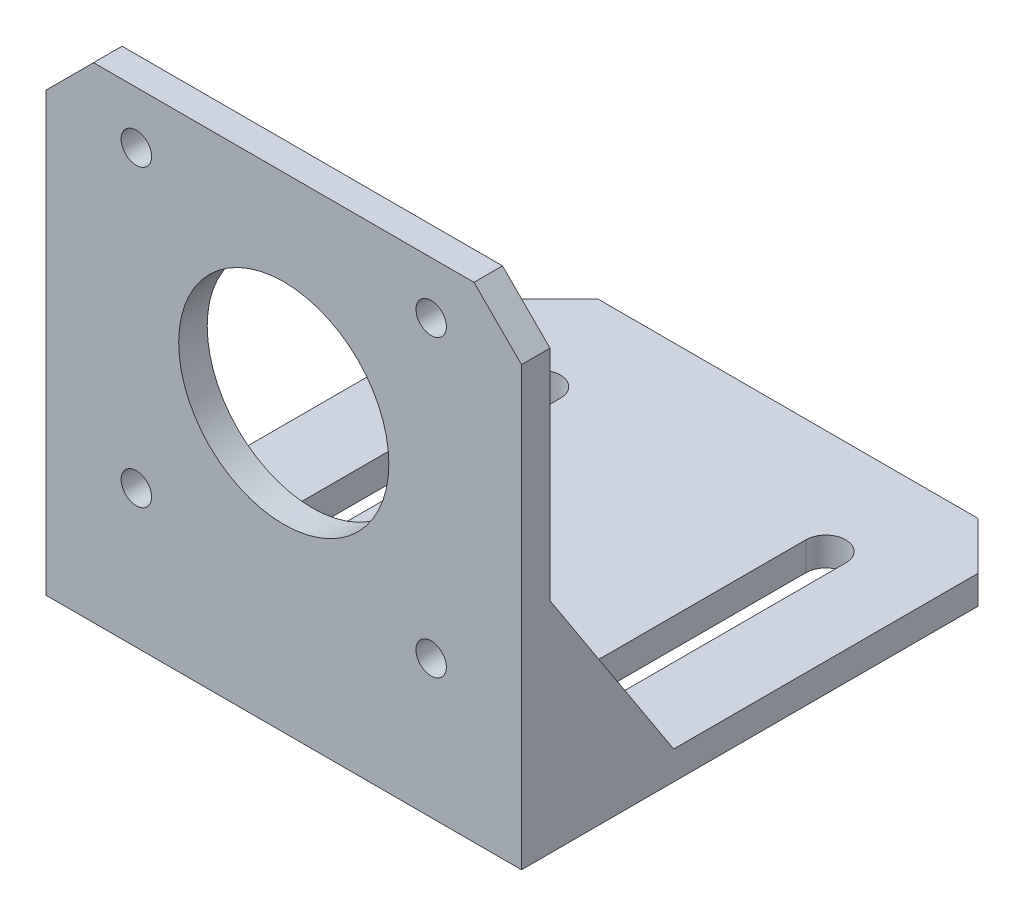
ISO-10303-21;
HEADER;
FILE_DESCRIPTION(('STEP AP214'),'2;1');
FILE_NAME('part.step','',(''),(''),'','','');
FILE_SCHEMA(('AUTOMOTIVE_DESIGN { 1 0 10303 214 1 1 1 1 }'));
ENDSEC;
DATA;
#1=APPLICATION_CONTEXT('core data for automotive mechanical design processes');
#2=APPLICATION_PROTOCOL_DEFINITION('international standard','automotive_design',2000,#1);
#3=PRODUCT_CONTEXT('',#1,'mechanical');
#4=PRODUCT('Part','Part','',(#3));
#5=PRODUCT_RELATED_PRODUCT_CATEGORY('part','',(#4));
#6=PRODUCT_DEFINITION_FORMATION('','',#4);
#7=PRODUCT_DEFINITION_CONTEXT('part definition',#1,'design');
#8=PRODUCT_DEFINITION('design','',#6,#7);
#9=PRODUCT_DEFINITION_SHAPE('','',#8);
#10=(LENGTH_UNIT() NAMED_UNIT(*) SI_UNIT(.MILLI.,.METRE.));
#11=(NAMED_UNIT(*) PLANE_ANGLE_UNIT() SI_UNIT($,.RADIAN.));
#12=(NAMED_UNIT(*) SI_UNIT($,.STERADIAN.) SOLID_ANGLE_UNIT());
#13=UNCERTAINTY_MEASURE_WITH_UNIT(LENGTH_MEASURE(1.E-05),#10,'distance_accuracy_value','');
#14=(GEOMETRIC_REPRESENTATION_CONTEXT(3) GLOBAL_UNCERTAINTY_ASSIGNED_CONTEXT((#13)) GLOBAL_UNIT_ASSIGNED_CONTEXT((#10,
#11,#12)) REPRESENTATION_CONTEXT('',''));
#15=CARTESIAN_POINT('',(0.,0.,0.));
#16=DIRECTION('',(0.,0.,1.));
#17=DIRECTION('',(1.,0.,0.));
#18=AXIS2_PLACEMENT_3D('',#15,#16,#17);
#19=CARTESIAN_POINT('',(50.,-6.94551845342701,10.6854130052724));
#20=DIRECTION('',(0.,0.544988350595413,-0.838443616300638));
#21=DIRECTION('',(0.,0.838443616300638,0.544988350595413));
#22=AXIS2_PLACEMENT_3D('',#19,#20,#21);
#23=PLANE('',#22);
#24=DIRECTION('',(-1.,0.,0.));
#25=VECTOR('',#24,1.);
#26=CARTESIAN_POINT('',(50.,-27.9999999999999,-3.));
#27=LINE('',#26,#25);
#28=CARTESIAN_POINT('',(3.,-28.,-3.00000000000001));
#29=VERTEX_POINT('',#28);
#30=CARTESIAN_POINT('',(0.,-27.9999999999999,-3.));
#31=VERTEX_POINT('',#30);
#32=EDGE_CURVE('E219',#29,#31,#27,.T.);
#33=ORIENTED_EDGE('',*,*,#32,.F.);
#34=DIRECTION('',(0.,-0.838443616300638,-0.544988350595413));
#35=VECTOR('',#34,1.);
#36=CARTESIAN_POINT('',(3.,-6.94551845342701,10.6854130052724));
#37=LINE('',#36,#35);
#38=CARTESIAN_POINT('',(3.,-48.,-16.));
#39=VERTEX_POINT('',#38);
#40=EDGE_CURVE('E11',#29,#39,#37,.T.);
#41=ORIENTED_EDGE('',*,*,#40,.T.);
#42=DIRECTION('',(-1.,0.,0.));
#43=VECTOR('',#42,1.);
#44=CARTESIAN_POINT('',(50.,-48.,-16.));
#45=LINE('',#44,#43);
#46=CARTESIAN_POINT('',(0.,-48.,-16.));
#47=VERTEX_POINT('',#46);
#48=EDGE_CURVE('E268',#39,#47,#45,.T.);
#49=ORIENTED_EDGE('',*,*,#48,.T.);
#50=DIRECTION('',(0.,-0.838443616300638,-0.544988350595413));
#51=VECTOR('',#50,1.);
#52=CARTESIAN_POINT('',(0.,-6.94551845342701,10.6854130052724));
#53=LINE('',#52,#51);
#54=EDGE_CURVE('E269',#31,#47,#53,.T.);
#55=ORIENTED_EDGE('',*,*,#54,.F.);
#56=EDGE_LOOP('',(#33,#41,#49,#55));
#57=FACE_BOUND('',#56,.T.);
#58=ADVANCED_FACE('F45',(#57),#23,.T.);
#59=CARTESIAN_POINT('',(50.,-48.,-16.));
#60=VERTEX_POINT('',#59);
#61=CARTESIAN_POINT('',(47.,-48.,-16.));
#62=VERTEX_POINT('',#61);
#63=EDGE_CURVE('E241',#60,#62,#45,.T.);
#64=ORIENTED_EDGE('',*,*,#63,.T.);
#65=DIRECTION('',(0.,0.838443616300638,0.544988350595413));
#66=VECTOR('',#65,1.);
#67=CARTESIAN_POINT('',(47.,-6.94551845342701,10.6854130052724));
#68=LINE('',#67,#66);
#69=CARTESIAN_POINT('',(47.,-28.,-3.00000000000001));
#70=VERTEX_POINT('',#69);
#71=EDGE_CURVE('E53',#62,#70,#68,.T.);
#72=ORIENTED_EDGE('',*,*,#71,.T.);
#73=CARTESIAN_POINT('',(50.,-27.9999999999999,-3.));
#74=VERTEX_POINT('',#73);
#75=EDGE_CURVE('E224',#74,#70,#27,.T.);
#76=ORIENTED_EDGE('',*,*,#75,.F.);
#77=DIRECTION('',(0.,-0.838443616300638,-0.544988350595413));
#78=VECTOR('',#77,1.);
#79=CARTESIAN_POINT('',(50.,-6.94551845342701,10.6854130052724));
#80=LINE('',#79,#78);
#81=EDGE_CURVE('E252',#74,#60,#80,.T.);
#82=ORIENTED_EDGE('',*,*,#81,.T.);
#83=EDGE_LOOP('',(#64,#72,#76,#82));
#84=FACE_BOUND('',#83,.T.);
#85=ADVANCED_FACE('F237',(#84),#23,.T.);
#86=CARTESIAN_POINT('',(50.,0.,-3.));
#87=DIRECTION('',(0.,0.,-1.));
#88=DIRECTION('',(0.,1.,0.));
#89=AXIS2_PLACEMENT_3D('',#86,#87,#88);
#90=PLANE('',#89);
#91=CARTESIAN_POINT('',(40.5,-5.50000000000001,-3.));
#92=DIRECTION('',(0.,0.,-1.));
#93=DIRECTION('',(0.,1.,0.));
#94=AXIS2_PLACEMENT_3D('',#91,#92,#93);
#95=CIRCLE('',#94,1.6);
#96=CARTESIAN_POINT('',(40.5,-3.90000000000001,-3.));
#97=VERTEX_POINT('',#96);
#98=EDGE_CURVE('E457',#97,#97,#95,.T.);
#99=ORIENTED_EDGE('',*,*,#98,.F.);
#100=EDGE_LOOP('',(#99));
#101=FACE_BOUND('',#100,.T.);
#102=DIRECTION('',(-0.707106781186547,0.707106781186548,0.));
#103=VECTOR('',#102,1.);
#104=CARTESIAN_POINT('',(50.,-5.,-3.));
#105=LINE('',#104,#103);
#106=CARTESIAN_POINT('',(50.,-5.,-3.));
#107=VERTEX_POINT('',#106);
#108=CARTESIAN_POINT('',(45.,0.,-3.));
#109=VERTEX_POINT('',#108);
#110=EDGE_CURVE('E248',#107,#109,#105,.T.);
#111=ORIENTED_EDGE('',*,*,#110,.F.);
#112=DIRECTION('',(0.,-1.,0.));
#113=VECTOR('',#112,1.);
#114=CARTESIAN_POINT('',(50.,0.,-3.));
#115=LINE('',#114,#113);
#116=EDGE_CURVE('E247',#107,#74,#115,.T.);
#117=ORIENTED_EDGE('',*,*,#116,.T.);
#118=ORIENTED_EDGE('',*,*,#75,.T.);
#119=DIRECTION('',(0.,-1.,0.));
#120=VECTOR('',#119,1.);
#121=CARTESIAN_POINT('',(47.,-28.,-3.00000000000001));
#122=LINE('',#121,#120);
#123=CARTESIAN_POINT('',(47.,-48.,-3.00000000000001));
#124=VERTEX_POINT('',#123);
#125=EDGE_CURVE('E245',#70,#124,#122,.T.);
#126=ORIENTED_EDGE('',*,*,#125,.T.);
#127=DIRECTION('',(1.,0.,0.));
#128=VECTOR('',#127,1.);
#129=CARTESIAN_POINT('',(3.,-48.,-3.00000000000001));
#130=LINE('',#129,#128);
#131=CARTESIAN_POINT('',(3.,-48.,-3.00000000000001));
#132=VERTEX_POINT('',#131);
#133=EDGE_CURVE('E431',#132,#124,#130,.T.);
#134=ORIENTED_EDGE('',*,*,#133,.F.);
#135=DIRECTION('',(0.,-1.,0.));
#136=VECTOR('',#135,1.);
#137=CARTESIAN_POINT('',(3.,-28.,-3.00000000000001));
#138=LINE('',#137,#136);
#139=EDGE_CURVE('E273',#29,#132,#138,.T.);
#140=ORIENTED_EDGE('',*,*,#139,.F.);
#141=ORIENTED_EDGE('',*,*,#32,.T.);
#142=DIRECTION('',(0.,-1.,0.));
#143=VECTOR('',#142,1.);
#144=CARTESIAN_POINT('',(0.,0.,-3.));
#145=LINE('',#144,#143);
#146=CARTESIAN_POINT('',(0.,-5.,-3.));
#147=VERTEX_POINT('',#146);
#148=EDGE_CURVE('E211',#147,#31,#145,.T.);
#149=ORIENTED_EDGE('',*,*,#148,.F.);
#150=DIRECTION('',(-0.707106781186548,-0.707106781186547,0.));
#151=VECTOR('',#150,1.);
#152=CARTESIAN_POINT('',(0.,-5.,-3.));
#153=LINE('',#152,#151);
#154=CARTESIAN_POINT('',(5.,0.,-3.));
#155=VERTEX_POINT('',#154);
#156=EDGE_CURVE('E68',#155,#147,#153,.T.);
#157=ORIENTED_EDGE('',*,*,#156,.F.);
#158=DIRECTION('',(-1.,0.,0.));
#159=VECTOR('',#158,1.);
#160=CARTESIAN_POINT('',(50.,0.,-3.));
#161=LINE('',#160,#159);
#162=EDGE_CURVE('E209',#109,#155,#161,.T.);
#163=ORIENTED_EDGE('',*,*,#162,.F.);
#164=EDGE_LOOP('',(#111,#117,#118,#126,#134,#140,#141,#149,#157,#163));
#165=FACE_BOUND('',#164,.T.);
#166=CARTESIAN_POINT('',(9.50000000000001,-5.50000000000001,-3.));
#167=DIRECTION('',(0.,0.,-1.));
#168=DIRECTION('',(0.,1.,0.));
#169=AXIS2_PLACEMENT_3D('',#166,#167,#168);
#170=CIRCLE('',#169,1.6);
#171=CARTESIAN_POINT('',(9.50000000000001,-3.90000000000001,-3.));
#172=VERTEX_POINT('',#171);
#173=EDGE_CURVE('E471',#172,#172,#170,.T.);
#174=ORIENTED_EDGE('',*,*,#173,.F.);
#175=EDGE_LOOP('',(#174));
#176=FACE_BOUND('',#175,.T.);
#177=CARTESIAN_POINT('',(9.49999999999969,-36.5,-3.));
#178=DIRECTION('',(0.,0.,-1.));
#179=DIRECTION('',(0.,1.,0.));
#180=AXIS2_PLACEMENT_3D('',#177,#178,#179);
#181=CIRCLE('',#180,1.6);
#182=CARTESIAN_POINT('',(9.49999999999969,-34.9,-3.));
#183=VERTEX_POINT('',#182);
#184=EDGE_CURVE('E483',#183,#183,#181,.T.);
#185=ORIENTED_EDGE('',*,*,#184,.F.);
#186=EDGE_LOOP('',(#185));
#187=FACE_BOUND('',#186,.T.);
#188=CARTESIAN_POINT('',(40.4999999999997,-36.5,-3.));
#189=DIRECTION('',(0.,0.,-1.));
#190=DIRECTION('',(0.,1.,0.));
#191=AXIS2_PLACEMENT_3D('',#188,#189,#190);
#192=CIRCLE('',#191,1.6);
#193=CARTESIAN_POINT('',(40.4999999999997,-34.9,-3.));
#194=VERTEX_POINT('',#193);
#195=EDGE_CURVE('E491',#194,#194,#192,.T.);
#196=ORIENTED_EDGE('',*,*,#195,.F.);
#197=EDGE_LOOP('',(#196));
#198=FACE_BOUND('',#197,.T.);
#199=CARTESIAN_POINT('',(25.,-21.,-3.));
#200=DIRECTION('',(0.,0.,-1.));
#201=DIRECTION('',(0.,1.,0.));
#202=AXIS2_PLACEMENT_3D('',#199,#200,#201);
#203=CIRCLE('',#202,11.05);
#204=CARTESIAN_POINT('',(25.,-9.95,-3.));
#205=VERTEX_POINT('',#204);
#206=EDGE_CURVE('E461',#205,#205,#203,.T.);
#207=ORIENTED_EDGE('',*,*,#206,.F.);
#208=EDGE_LOOP('',(#207));
#209=FACE_BOUND('',#208,.T.);
#210=ADVANCED_FACE('F207',(#101,#165,#176,#187,#198,#209),#90,.T.);
#211=CARTESIAN_POINT('',(50.,0.,0.));
#212=DIRECTION('',(0.,1.,0.));
#213=DIRECTION('',(0.,0.,1.));
#214=AXIS2_PLACEMENT_3D('',#211,#212,#213);
#215=PLANE('',#214);
#216=DIRECTION('',(0.,0.,-1.));
#217=VECTOR('',#216,1.);
#218=CARTESIAN_POINT('',(45.,0.,0.));
#219=LINE('',#218,#217);
#220=CARTESIAN_POINT('',(45.,0.,0.));
#221=VERTEX_POINT('',#220);
#222=EDGE_CURVE('E217',#221,#109,#219,.T.);
#223=ORIENTED_EDGE('',*,*,#222,.T.);
#224=ORIENTED_EDGE('',*,*,#162,.T.);
#225=DIRECTION('',(0.,0.,-1.));
#226=VECTOR('',#225,1.);
#227=CARTESIAN_POINT('',(5.,0.,0.));
#228=LINE('',#227,#226);
#229=CARTESIAN_POINT('',(5.,0.,0.));
#230=VERTEX_POINT('',#229);
#231=EDGE_CURVE('E192',#230,#155,#228,.T.);
#232=ORIENTED_EDGE('',*,*,#231,.F.);
#233=DIRECTION('',(-1.,0.,0.));
#234=VECTOR('',#233,1.);
#235=CARTESIAN_POINT('',(50.,0.,0.));
#236=LINE('',#235,#234);
#237=EDGE_CURVE('E220',#221,#230,#236,.T.);
#238=ORIENTED_EDGE('',*,*,#237,.F.);
#239=EDGE_LOOP('',(#223,#224,#232,#238));
#240=FACE_BOUND('',#239,.T.);
#241=ADVANCED_FACE('F216',(#240),#215,.T.);
#242=CARTESIAN_POINT('',(50.,0.,0.));
#243=DIRECTION('',(0.,0.,-1.));
#244=DIRECTION('',(-1.,0.,0.));
#245=AXIS2_PLACEMENT_3D('',#242,#243,#244);
#246=PLANE('',#245);
#247=CARTESIAN_POINT('',(40.5,-5.50000000000001,0.));
#248=DIRECTION('',(0.,0.,-1.));
#249=DIRECTION('',(0.,1.,0.));
#250=AXIS2_PLACEMENT_3D('',#247,#248,#249);
#251=CIRCLE('',#250,1.6);
#252=CARTESIAN_POINT('',(40.5,-3.90000000000001,0.));
#253=VERTEX_POINT('',#252);
#254=EDGE_CURVE('E462',#253,#253,#251,.T.);
#255=ORIENTED_EDGE('',*,*,#254,.T.);
#256=EDGE_LOOP('',(#255));
#257=FACE_BOUND('',#256,.T.);
#258=CARTESIAN_POINT('',(9.50000000000001,-5.50000000000001,0.));
#259=DIRECTION('',(0.,0.,-1.));
#260=DIRECTION('',(0.,1.,0.));
#261=AXIS2_PLACEMENT_3D('',#258,#259,#260);
#262=CIRCLE('',#261,1.6);
#263=CARTESIAN_POINT('',(9.50000000000001,-3.90000000000001,0.));
#264=VERTEX_POINT('',#263);
#265=EDGE_CURVE('E479',#264,#264,#262,.T.);
#266=ORIENTED_EDGE('',*,*,#265,.T.);
#267=EDGE_LOOP('',(#266));
#268=FACE_BOUND('',#267,.T.);
#269=CARTESIAN_POINT('',(9.49999999999969,-36.5,0.));
#270=DIRECTION('',(0.,0.,-1.));
#271=DIRECTION('',(0.,1.,0.));
#272=AXIS2_PLACEMENT_3D('',#269,#270,#271);
#273=CIRCLE('',#272,1.6);
#274=CARTESIAN_POINT('',(9.49999999999969,-34.9,0.));
#275=VERTEX_POINT('',#274);
#276=EDGE_CURVE('E487',#275,#275,#273,.T.);
#277=ORIENTED_EDGE('',*,*,#276,.T.);
#278=EDGE_LOOP('',(#277));
#279=FACE_BOUND('',#278,.T.);
#280=CARTESIAN_POINT('',(40.4999999999997,-36.5,0.));
#281=DIRECTION('',(0.,0.,-1.));
#282=DIRECTION('',(0.,1.,0.));
#283=AXIS2_PLACEMENT_3D('',#280,#281,#282);
#284=CIRCLE('',#283,1.6);
#285=CARTESIAN_POINT('',(40.4999999999997,-34.9,0.));
#286=VERTEX_POINT('',#285);
#287=EDGE_CURVE('E213',#286,#286,#284,.T.);
#288=ORIENTED_EDGE('',*,*,#287,.T.);
#289=EDGE_LOOP('',(#288));
#290=FACE_BOUND('',#289,.T.);
#291=CARTESIAN_POINT('',(25.,-21.,0.));
#292=DIRECTION('',(0.,0.,-1.));
#293=DIRECTION('',(0.,1.,0.));
#294=AXIS2_PLACEMENT_3D('',#291,#292,#293);
#295=CIRCLE('',#294,11.05);
#296=CARTESIAN_POINT('',(25.,-9.95,0.));
#297=VERTEX_POINT('',#296);
#298=EDGE_CURVE('E423',#297,#297,#295,.T.);
#299=ORIENTED_EDGE('',*,*,#298,.T.);
#300=EDGE_LOOP('',(#299));
#301=FACE_BOUND('',#300,.T.);
#302=DIRECTION('',(0.,-1.,0.));
#303=VECTOR('',#302,1.);
#304=CARTESIAN_POINT('',(50.,0.,0.));
#305=LINE('',#304,#303);
#306=CARTESIAN_POINT('',(50.,-5.,0.));
#307=VERTEX_POINT('',#306);
#308=CARTESIAN_POINT('',(50.,-51.,0.));
#309=VERTEX_POINT('',#308);
#310=EDGE_CURVE('E251',#307,#309,#305,.T.);
#311=ORIENTED_EDGE('',*,*,#310,.F.);
#312=DIRECTION('',(-0.707106781186547,0.707106781186548,0.));
#313=VECTOR('',#312,1.);
#314=CARTESIAN_POINT('',(50.,-5.,0.));
#315=LINE('',#314,#313);
#316=EDGE_CURVE('E60',#307,#221,#315,.T.);
#317=ORIENTED_EDGE('',*,*,#316,.T.);
#318=ORIENTED_EDGE('',*,*,#237,.T.);
#319=DIRECTION('',(-0.707106781186548,-0.707106781186547,0.));
#320=VECTOR('',#319,1.);
#321=CARTESIAN_POINT('',(0.,-5.,0.));
#322=LINE('',#321,#320);
#323=CARTESIAN_POINT('',(0.,-5.,0.));
#324=VERTEX_POINT('',#323);
#325=EDGE_CURVE('E195',#230,#324,#322,.T.);
#326=ORIENTED_EDGE('',*,*,#325,.T.);
#327=DIRECTION('',(0.,-1.,0.));
#328=VECTOR('',#327,1.);
#329=CARTESIAN_POINT('',(0.,0.,0.));
#330=LINE('',#329,#328);
#331=CARTESIAN_POINT('',(0.,-51.,0.));
#332=VERTEX_POINT('',#331);
#333=EDGE_CURVE('E276',#324,#332,#330,.T.);
#334=ORIENTED_EDGE('',*,*,#333,.T.);
#335=DIRECTION('',(-1.,0.,0.));
#336=VECTOR('',#335,1.);
#337=CARTESIAN_POINT('',(50.,-51.,0.));
#338=LINE('',#337,#336);
#339=EDGE_CURVE('E226',#309,#332,#338,.T.);
#340=ORIENTED_EDGE('',*,*,#339,.F.);
#341=EDGE_LOOP('',(#311,#317,#318,#326,#334,#340));
#342=FACE_BOUND('',#341,.T.);
#343=ADVANCED_FACE('F509',(#257,#268,#279,#290,#301,#342),#246,.F.);
#344=CARTESIAN_POINT('',(50.,-51.,0.));
#345=DIRECTION('',(0.,1.,0.));
#346=DIRECTION('',(0.,0.,1.));
#347=AXIS2_PLACEMENT_3D('',#344,#345,#346);
#348=PLANE('',#347);
#349=DIRECTION('',(0.,0.,-1.));
#350=VECTOR('',#349,1.);
#351=CARTESIAN_POINT('',(12.1,-51.,-42.));
#352=LINE('',#351,#350);
#353=CARTESIAN_POINT('',(12.1,-51.,-12.));
#354=VERTEX_POINT('',#353);
#355=CARTESIAN_POINT('',(12.1,-51.,-42.));
#356=VERTEX_POINT('',#355);
#357=EDGE_CURVE('E330',#354,#356,#352,.T.);
#358=ORIENTED_EDGE('',*,*,#357,.T.);
#359=CARTESIAN_POINT('',(10.,-51.,-42.));
#360=DIRECTION('',(0.,1.,0.));
#361=DIRECTION('',(0.,0.,1.));
#362=AXIS2_PLACEMENT_3D('',#359,#360,#361);
#363=CIRCLE('',#362,2.1);
#364=CARTESIAN_POINT('',(7.9,-51.,-42.));
#365=VERTEX_POINT('',#364);
#366=EDGE_CURVE('E346',#356,#365,#363,.T.);
#367=ORIENTED_EDGE('',*,*,#366,.T.);
#368=DIRECTION('',(0.,0.,1.));
#369=VECTOR('',#368,1.);
#370=CARTESIAN_POINT('',(7.9,-51.,-42.));
#371=LINE('',#370,#369);
#372=CARTESIAN_POINT('',(7.9,-51.,-12.));
#373=VERTEX_POINT('',#372);
#374=EDGE_CURVE('E364',#365,#373,#371,.T.);
#375=ORIENTED_EDGE('',*,*,#374,.T.);
#376=CARTESIAN_POINT('',(10.,-51.,-12.));
#377=DIRECTION('',(0.,1.,0.));
#378=DIRECTION('',(0.,0.,1.));
#379=AXIS2_PLACEMENT_3D('',#376,#377,#378);
#380=CIRCLE('',#379,2.1);
#381=EDGE_CURVE('E360',#373,#354,#380,.T.);
#382=ORIENTED_EDGE('',*,*,#381,.T.);
#383=EDGE_LOOP('',(#358,#367,#375,#382));
#384=FACE_BOUND('',#383,.T.);
#385=DIRECTION('',(0.,0.,-1.));
#386=VECTOR('',#385,1.);
#387=CARTESIAN_POINT('',(42.1,-51.,-42.));
#388=LINE('',#387,#386);
#389=CARTESIAN_POINT('',(42.1,-51.,-12.));
#390=VERTEX_POINT('',#389);
#391=CARTESIAN_POINT('',(42.1,-51.,-42.));
#392=VERTEX_POINT('',#391);
#393=EDGE_CURVE('E375',#390,#392,#388,.T.);
#394=ORIENTED_EDGE('',*,*,#393,.T.);
#395=CARTESIAN_POINT('',(40.,-51.,-42.));
#396=DIRECTION('',(0.,1.,0.));
#397=DIRECTION('',(0.,0.,-1.));
#398=AXIS2_PLACEMENT_3D('',#395,#396,#397);
#399=CIRCLE('',#398,2.1);
#400=CARTESIAN_POINT('',(37.9,-51.,-42.));
#401=VERTEX_POINT('',#400);
#402=EDGE_CURVE('E391',#392,#401,#399,.T.);
#403=ORIENTED_EDGE('',*,*,#402,.T.);
#404=DIRECTION('',(0.,0.,1.));
#405=VECTOR('',#404,1.);
#406=CARTESIAN_POINT('',(37.9,-51.,-42.));
#407=LINE('',#406,#405);
#408=CARTESIAN_POINT('',(37.9,-51.,-12.));
#409=VERTEX_POINT('',#408);
#410=EDGE_CURVE('E408',#401,#409,#407,.T.);
#411=ORIENTED_EDGE('',*,*,#410,.T.);
#412=CARTESIAN_POINT('',(40.,-51.,-12.));
#413=DIRECTION('',(0.,1.,0.));
#414=DIRECTION('',(0.,0.,-1.));
#415=AXIS2_PLACEMENT_3D('',#412,#413,#414);
#416=CIRCLE('',#415,2.1);
#417=EDGE_CURVE('E404',#409,#390,#416,.T.);
#418=ORIENTED_EDGE('',*,*,#417,.T.);
#419=EDGE_LOOP('',(#394,#403,#411,#418));
#420=FACE_BOUND('',#419,.T.);
#421=DIRECTION('',(0.,0.,-1.));
#422=VECTOR('',#421,1.);
#423=CARTESIAN_POINT('',(0.,-51.,0.));
#424=LINE('',#423,#422);
#425=CARTESIAN_POINT('',(0.,-51.,-48.));
#426=VERTEX_POINT('',#425);
#427=EDGE_CURVE('E279',#332,#426,#424,.T.);
#428=ORIENTED_EDGE('',*,*,#427,.T.);
#429=DIRECTION('',(0.707106781186548,0.,-0.707106781186547));
#430=VECTOR('',#429,1.);
#431=CARTESIAN_POINT('',(5.,-51.,-53.));
#432=LINE('',#431,#430);
#433=CARTESIAN_POINT('',(5.,-51.,-53.));
#434=VERTEX_POINT('',#433);
#435=EDGE_CURVE('E315',#426,#434,#432,.T.);
#436=ORIENTED_EDGE('',*,*,#435,.T.);
#437=DIRECTION('',(-1.,0.,0.));
#438=VECTOR('',#437,1.);
#439=CARTESIAN_POINT('',(50.,-51.,-53.));
#440=LINE('',#439,#438);
#441=CARTESIAN_POINT('',(45.,-51.,-53.));
#442=VERTEX_POINT('',#441);
#443=EDGE_CURVE('E291',#442,#434,#440,.T.);
#444=ORIENTED_EDGE('',*,*,#443,.F.);
#445=DIRECTION('',(0.707106781186548,0.,0.707106781186547));
#446=VECTOR('',#445,1.);
#447=CARTESIAN_POINT('',(45.,-51.,-53.));
#448=LINE('',#447,#446);
#449=CARTESIAN_POINT('',(50.,-51.,-48.));
#450=VERTEX_POINT('',#449);
#451=EDGE_CURVE('E418',#442,#450,#448,.T.);
#452=ORIENTED_EDGE('',*,*,#451,.T.);
#453=DIRECTION('',(0.,0.,-1.));
#454=VECTOR('',#453,1.);
#455=CARTESIAN_POINT('',(50.,-51.,0.));
#456=LINE('',#455,#454);
#457=EDGE_CURVE('E256',#309,#450,#456,.T.);
#458=ORIENTED_EDGE('',*,*,#457,.F.);
#459=ORIENTED_EDGE('',*,*,#339,.T.);
#460=EDGE_LOOP('',(#428,#436,#444,#452,#458,#459));
#461=FACE_BOUND('',#460,.T.);
#462=ADVANCED_FACE('F300',(#384,#420,#461),#348,.F.);
#463=CARTESIAN_POINT('',(50.,0.,-53.));
#464=DIRECTION('',(0.,0.,-1.));
#465=DIRECTION('',(0.,1.,0.));
#466=AXIS2_PLACEMENT_3D('',#463,#464,#465);
#467=PLANE('',#466);
#468=DIRECTION('',(0.,1.,0.));
#469=VECTOR('',#468,1.);
#470=CARTESIAN_POINT('',(5.,-51.,-53.));
#471=LINE('',#470,#469);
#472=CARTESIAN_POINT('',(5.,-48.,-53.));
#473=VERTEX_POINT('',#472);
#474=EDGE_CURVE('E314',#434,#473,#471,.T.);
#475=ORIENTED_EDGE('',*,*,#474,.T.);
#476=DIRECTION('',(-1.,0.,0.));
#477=VECTOR('',#476,1.);
#478=CARTESIAN_POINT('',(50.,-48.,-53.));
#479=LINE('',#478,#477);
#480=CARTESIAN_POINT('',(45.,-48.,-53.));
#481=VERTEX_POINT('',#480);
#482=EDGE_CURVE('E287',#481,#473,#479,.T.);
#483=ORIENTED_EDGE('',*,*,#482,.F.);
#484=DIRECTION('',(0.,1.,0.));
#485=VECTOR('',#484,1.);
#486=CARTESIAN_POINT('',(45.,-51.,-53.));
#487=LINE('',#486,#485);
#488=EDGE_CURVE('E415',#442,#481,#487,.T.);
#489=ORIENTED_EDGE('',*,*,#488,.F.);
#490=ORIENTED_EDGE('',*,*,#443,.T.);
#491=EDGE_LOOP('',(#475,#483,#489,#490));
#492=FACE_BOUND('',#491,.T.);
#493=ADVANCED_FACE('F501',(#492),#467,.T.);
#494=CARTESIAN_POINT('',(50.,-48.,0.));
#495=DIRECTION('',(0.,-1.,0.));
#496=DIRECTION('',(0.,0.,-1.));
#497=AXIS2_PLACEMENT_3D('',#494,#495,#496);
#498=PLANE('',#497);
#499=DIRECTION('',(0.,0.,1.));
#500=VECTOR('',#499,1.);
#501=CARTESIAN_POINT('',(7.9,-48.,-42.));
#502=LINE('',#501,#500);
#503=CARTESIAN_POINT('',(7.90000000000001,-48.,-42.));
#504=VERTEX_POINT('',#503);
#505=CARTESIAN_POINT('',(7.9,-48.,-12.));
#506=VERTEX_POINT('',#505);
#507=EDGE_CURVE('E350',#504,#506,#502,.T.);
#508=ORIENTED_EDGE('',*,*,#507,.F.);
#509=CARTESIAN_POINT('',(10.,-48.,-42.));
#510=DIRECTION('',(0.,1.,0.));
#511=DIRECTION('',(0.,0.,1.));
#512=AXIS2_PLACEMENT_3D('',#509,#510,#511);
#513=CIRCLE('',#512,2.1);
#514=CARTESIAN_POINT('',(12.1,-48.,-42.));
#515=VERTEX_POINT('',#514);
#516=EDGE_CURVE('E354',#515,#504,#513,.T.);
#517=ORIENTED_EDGE('',*,*,#516,.F.);
#518=DIRECTION('',(0.,0.,-1.));
#519=VECTOR('',#518,1.);
#520=CARTESIAN_POINT('',(12.1,-48.,-42.));
#521=LINE('',#520,#519);
#522=CARTESIAN_POINT('',(12.1,-48.,-12.));
#523=VERTEX_POINT('',#522);
#524=EDGE_CURVE('E341',#523,#515,#521,.T.);
#525=ORIENTED_EDGE('',*,*,#524,.F.);
#526=CARTESIAN_POINT('',(10.,-48.,-12.));
#527=DIRECTION('',(0.,1.,0.));
#528=DIRECTION('',(0.,0.,1.));
#529=AXIS2_PLACEMENT_3D('',#526,#527,#528);
#530=CIRCLE('',#529,2.1);
#531=EDGE_CURVE('E345',#506,#523,#530,.T.);
#532=ORIENTED_EDGE('',*,*,#531,.F.);
#533=EDGE_LOOP('',(#508,#517,#525,#532));
#534=FACE_BOUND('',#533,.T.);
#535=DIRECTION('',(0.,0.,1.));
#536=VECTOR('',#535,1.);
#537=CARTESIAN_POINT('',(37.9,-48.,-42.));
#538=LINE('',#537,#536);
#539=CARTESIAN_POINT('',(37.9,-48.,-42.));
#540=VERTEX_POINT('',#539);
#541=CARTESIAN_POINT('',(37.9,-48.,-12.));
#542=VERTEX_POINT('',#541);
#543=EDGE_CURVE('E395',#540,#542,#538,.T.);
#544=ORIENTED_EDGE('',*,*,#543,.F.);
#545=CARTESIAN_POINT('',(40.,-48.,-42.));
#546=DIRECTION('',(0.,1.,0.));
#547=DIRECTION('',(0.,0.,-1.));
#548=AXIS2_PLACEMENT_3D('',#545,#546,#547);
#549=CIRCLE('',#548,2.1);
#550=CARTESIAN_POINT('',(42.1,-48.,-42.));
#551=VERTEX_POINT('',#550);
#552=EDGE_CURVE('E340',#551,#540,#549,.T.);
#553=ORIENTED_EDGE('',*,*,#552,.F.);
#554=DIRECTION('',(0.,0.,-1.));
#555=VECTOR('',#554,1.);
#556=CARTESIAN_POINT('',(42.1,-48.,-42.));
#557=LINE('',#556,#555);
#558=CARTESIAN_POINT('',(42.1,-48.,-12.));
#559=VERTEX_POINT('',#558);
#560=EDGE_CURVE('E386',#559,#551,#557,.T.);
#561=ORIENTED_EDGE('',*,*,#560,.F.);
#562=CARTESIAN_POINT('',(40.,-48.,-12.));
#563=DIRECTION('',(0.,1.,0.));
#564=DIRECTION('',(0.,0.,-1.));
#565=AXIS2_PLACEMENT_3D('',#562,#563,#564);
#566=CIRCLE('',#565,2.1);
#567=EDGE_CURVE('E390',#542,#559,#566,.T.);
#568=ORIENTED_EDGE('',*,*,#567,.F.);
#569=EDGE_LOOP('',(#544,#553,#561,#568));
#570=FACE_BOUND('',#569,.T.);
#571=ORIENTED_EDGE('',*,*,#482,.T.);
#572=DIRECTION('',(0.707106781186548,0.,-0.707106781186547));
#573=VECTOR('',#572,1.);
#574=CARTESIAN_POINT('',(5.,-48.,-53.));
#575=LINE('',#574,#573);
#576=CARTESIAN_POINT('',(0.,-48.,-48.));
#577=VERTEX_POINT('',#576);
#578=EDGE_CURVE('E322',#577,#473,#575,.T.);
#579=ORIENTED_EDGE('',*,*,#578,.F.);
#580=DIRECTION('',(0.,0.,1.));
#581=VECTOR('',#580,1.);
#582=CARTESIAN_POINT('',(0.,-48.,0.));
#583=LINE('',#582,#581);
#584=EDGE_CURVE('E258',#577,#47,#583,.T.);
#585=ORIENTED_EDGE('',*,*,#584,.T.);
#586=ORIENTED_EDGE('',*,*,#48,.F.);
#587=DIRECTION('',(0.,0.,1.));
#588=VECTOR('',#587,1.);
#589=CARTESIAN_POINT('',(3.,-48.,-16.));
#590=LINE('',#589,#588);
#591=EDGE_CURVE('E320',#39,#132,#590,.T.);
#592=ORIENTED_EDGE('',*,*,#591,.T.);
#593=ORIENTED_EDGE('',*,*,#133,.T.);
#594=DIRECTION('',(0.,0.,-1.));
#595=VECTOR('',#594,1.);
#596=CARTESIAN_POINT('',(47.,-48.,-16.));
#597=LINE('',#596,#595);
#598=EDGE_CURVE('E434',#124,#62,#597,.T.);
#599=ORIENTED_EDGE('',*,*,#598,.T.);
#600=ORIENTED_EDGE('',*,*,#63,.F.);
#601=DIRECTION('',(0.,0.,1.));
#602=VECTOR('',#601,1.);
#603=CARTESIAN_POINT('',(50.,-48.,0.));
#604=LINE('',#603,#602);
#605=CARTESIAN_POINT('',(50.,-48.,-48.));
#606=VERTEX_POINT('',#605);
#607=EDGE_CURVE('E265',#606,#60,#604,.T.);
#608=ORIENTED_EDGE('',*,*,#607,.F.);
#609=DIRECTION('',(0.707106781186548,0.,0.707106781186547));
#610=VECTOR('',#609,1.);
#611=CARTESIAN_POINT('',(45.,-48.,-53.));
#612=LINE('',#611,#610);
#613=EDGE_CURVE('E385',#481,#606,#612,.T.);
#614=ORIENTED_EDGE('',*,*,#613,.F.);
#615=EDGE_LOOP('',(#571,#579,#585,#586,#592,#593,#599,#600,#608,#614));
#616=FACE_BOUND('',#615,.T.);
#617=ADVANCED_FACE('F446',(#534,#570,#616),#498,.F.);
#618=CARTESIAN_POINT('',(50.,0.,0.));
#619=DIRECTION('',(1.,0.,0.));
#620=DIRECTION('',(0.,0.,-1.));
#621=AXIS2_PLACEMENT_3D('',#618,#619,#620);
#622=PLANE('',#621);
#623=DIRECTION('',(0.,0.,-1.));
#624=VECTOR('',#623,1.);
#625=CARTESIAN_POINT('',(50.,-5.,0.));
#626=LINE('',#625,#624);
#627=EDGE_CURVE('E466',#307,#107,#626,.T.);
#628=ORIENTED_EDGE('',*,*,#627,.F.);
#629=ORIENTED_EDGE('',*,*,#310,.T.);
#630=ORIENTED_EDGE('',*,*,#457,.T.);
#631=DIRECTION('',(0.,1.,0.));
#632=VECTOR('',#631,1.);
#633=CARTESIAN_POINT('',(50.,-51.,-48.));
#634=LINE('',#633,#632);
#635=EDGE_CURVE('E419',#450,#606,#634,.T.);
#636=ORIENTED_EDGE('',*,*,#635,.T.);
#637=ORIENTED_EDGE('',*,*,#607,.T.);
#638=ORIENTED_EDGE('',*,*,#81,.F.);
#639=ORIENTED_EDGE('',*,*,#116,.F.);
#640=EDGE_LOOP('',(#628,#629,#630,#636,#637,#638,#639));
#641=FACE_BOUND('',#640,.T.);
#642=ADVANCED_FACE('F508',(#641),#622,.T.);
#643=CARTESIAN_POINT('',(0.,0.,0.));
#644=DIRECTION('',(1.,0.,0.));
#645=DIRECTION('',(0.,0.,-1.));
#646=AXIS2_PLACEMENT_3D('',#643,#644,#645);
#647=PLANE('',#646);
#648=ORIENTED_EDGE('',*,*,#333,.F.);
#649=DIRECTION('',(0.,0.,-1.));
#650=VECTOR('',#649,1.);
#651=CARTESIAN_POINT('',(0.,-5.,0.));
#652=LINE('',#651,#650);
#653=EDGE_CURVE('E201',#324,#147,#652,.T.);
#654=ORIENTED_EDGE('',*,*,#653,.T.);
#655=ORIENTED_EDGE('',*,*,#148,.T.);
#656=ORIENTED_EDGE('',*,*,#54,.T.);
#657=ORIENTED_EDGE('',*,*,#584,.F.);
#658=DIRECTION('',(0.,1.,0.));
#659=VECTOR('',#658,1.);
#660=CARTESIAN_POINT('',(0.,-51.,-48.));
#661=LINE('',#660,#659);
#662=EDGE_CURVE('E310',#426,#577,#661,.T.);
#663=ORIENTED_EDGE('',*,*,#662,.F.);
#664=ORIENTED_EDGE('',*,*,#427,.F.);
#665=EDGE_LOOP('',(#648,#654,#655,#656,#657,#663,#664));
#666=FACE_BOUND('',#665,.T.);
#667=ADVANCED_FACE('F308',(#666),#647,.F.);
#668=CARTESIAN_POINT('',(3.,-28.,-16.));
#669=DIRECTION('',(1.,0.,0.));
#670=DIRECTION('',(0.,0.,-1.));
#671=AXIS2_PLACEMENT_3D('',#668,#669,#670);
#672=PLANE('',#671);
#673=ORIENTED_EDGE('',*,*,#139,.T.);
#674=ORIENTED_EDGE('',*,*,#591,.F.);
#675=ORIENTED_EDGE('',*,*,#40,.F.);
#676=EDGE_LOOP('',(#673,#674,#675));
#677=FACE_BOUND('',#676,.T.);
#678=ADVANCED_FACE('F442',(#677),#672,.T.);
#679=CARTESIAN_POINT('',(47.,-28.,-16.));
#680=DIRECTION('',(-1.,0.,0.));
#681=DIRECTION('',(0.,0.,1.));
#682=AXIS2_PLACEMENT_3D('',#679,#680,#681);
#683=PLANE('',#682);
#684=ORIENTED_EDGE('',*,*,#598,.F.);
#685=ORIENTED_EDGE('',*,*,#125,.F.);
#686=ORIENTED_EDGE('',*,*,#71,.F.);
#687=EDGE_LOOP('',(#684,#685,#686));
#688=FACE_BOUND('',#687,.T.);
#689=ADVANCED_FACE('F561',(#688),#683,.T.);
#690=CARTESIAN_POINT('',(5.,-51.,-53.));
#691=DIRECTION('',(0.707106781186547,0.,0.707106781186548));
#692=DIRECTION('',(0.707106781186548,0.,-0.707106781186547));
#693=AXIS2_PLACEMENT_3D('',#690,#691,#692);
#694=PLANE('',#693);
#695=ORIENTED_EDGE('',*,*,#578,.T.);
#696=ORIENTED_EDGE('',*,*,#474,.F.);
#697=ORIENTED_EDGE('',*,*,#435,.F.);
#698=ORIENTED_EDGE('',*,*,#662,.T.);
#699=EDGE_LOOP('',(#695,#696,#697,#698));
#700=FACE_BOUND('',#699,.T.);
#701=ADVANCED_FACE('F498',(#700),#694,.F.);
#702=CARTESIAN_POINT('',(45.,-51.,-53.));
#703=DIRECTION('',(-0.707106781186547,0.,0.707106781186548));
#704=DIRECTION('',(0.707106781186548,0.,0.707106781186547));
#705=AXIS2_PLACEMENT_3D('',#702,#703,#704);
#706=PLANE('',#705);
#707=ORIENTED_EDGE('',*,*,#613,.T.);
#708=ORIENTED_EDGE('',*,*,#635,.F.);
#709=ORIENTED_EDGE('',*,*,#451,.F.);
#710=ORIENTED_EDGE('',*,*,#488,.T.);
#711=EDGE_LOOP('',(#707,#708,#709,#710));
#712=FACE_BOUND('',#711,.T.);
#713=ADVANCED_FACE('F507',(#712),#706,.F.);
#714=CARTESIAN_POINT('',(40.,-51.,-42.));
#715=DIRECTION('',(0.,1.,0.));
#716=DIRECTION('',(0.,0.,1.));
#717=AXIS2_PLACEMENT_3D('',#714,#715,#716);
#718=CYLINDRICAL_SURFACE('',#717,2.1);
#719=ORIENTED_EDGE('',*,*,#552,.T.);
#720=DIRECTION('',(0.,1.,0.));
#721=VECTOR('',#720,1.);
#722=CARTESIAN_POINT('',(37.9,-51.,-42.));
#723=LINE('',#722,#721);
#724=EDGE_CURVE('E371',#401,#540,#723,.T.);
#725=ORIENTED_EDGE('',*,*,#724,.F.);
#726=ORIENTED_EDGE('',*,*,#402,.F.);
#727=DIRECTION('',(0.,1.,0.));
#728=VECTOR('',#727,1.);
#729=CARTESIAN_POINT('',(42.1,-51.,-42.));
#730=LINE('',#729,#728);
#731=EDGE_CURVE('E382',#392,#551,#730,.T.);
#732=ORIENTED_EDGE('',*,*,#731,.T.);
#733=EDGE_LOOP('',(#719,#725,#726,#732));
#734=FACE_BOUND('',#733,.T.);
#735=ADVANCED_FACE('F579',(#734),#718,.F.);
#736=CARTESIAN_POINT('',(42.1,-51.,-42.));
#737=DIRECTION('',(1.,0.,0.));
#738=DIRECTION('',(0.,0.,-1.));
#739=AXIS2_PLACEMENT_3D('',#736,#737,#738);
#740=PLANE('',#739);
#741=ORIENTED_EDGE('',*,*,#560,.T.);
#742=ORIENTED_EDGE('',*,*,#731,.F.);
#743=ORIENTED_EDGE('',*,*,#393,.F.);
#744=DIRECTION('',(0.,1.,0.));
#745=VECTOR('',#744,1.);
#746=CARTESIAN_POINT('',(42.1,-51.,-12.));
#747=LINE('',#746,#745);
#748=EDGE_CURVE('E379',#390,#559,#747,.T.);
#749=ORIENTED_EDGE('',*,*,#748,.T.);
#750=EDGE_LOOP('',(#741,#742,#743,#749));
#751=FACE_BOUND('',#750,.T.);
#752=ADVANCED_FACE('F582',(#751),#740,.F.);
#753=CARTESIAN_POINT('',(40.,-51.,-12.));
#754=DIRECTION('',(0.,1.,0.));
#755=DIRECTION('',(0.,0.,1.));
#756=AXIS2_PLACEMENT_3D('',#753,#754,#755);
#757=CYLINDRICAL_SURFACE('',#756,2.1);
#758=ORIENTED_EDGE('',*,*,#567,.T.);
#759=ORIENTED_EDGE('',*,*,#748,.F.);
#760=ORIENTED_EDGE('',*,*,#417,.F.);
#761=DIRECTION('',(0.,1.,0.));
#762=VECTOR('',#761,1.);
#763=CARTESIAN_POINT('',(37.9,-51.,-12.));
#764=LINE('',#763,#762);
#765=EDGE_CURVE('E376',#409,#542,#764,.T.);
#766=ORIENTED_EDGE('',*,*,#765,.T.);
#767=EDGE_LOOP('',(#758,#759,#760,#766));
#768=FACE_BOUND('',#767,.T.);
#769=ADVANCED_FACE('F586',(#768),#757,.F.);
#770=CARTESIAN_POINT('',(37.9,-51.,-42.));
#771=DIRECTION('',(-1.,0.,0.));
#772=DIRECTION('',(0.,0.,1.));
#773=AXIS2_PLACEMENT_3D('',#770,#771,#772);
#774=PLANE('',#773);
#775=ORIENTED_EDGE('',*,*,#543,.T.);
#776=ORIENTED_EDGE('',*,*,#765,.F.);
#777=ORIENTED_EDGE('',*,*,#410,.F.);
#778=ORIENTED_EDGE('',*,*,#724,.T.);
#779=EDGE_LOOP('',(#775,#776,#777,#778));
#780=FACE_BOUND('',#779,.T.);
#781=ADVANCED_FACE('F566',(#780),#774,.F.);
#782=CARTESIAN_POINT('',(10.,-51.,-42.));
#783=DIRECTION('',(0.,1.,0.));
#784=DIRECTION('',(0.,0.,1.));
#785=AXIS2_PLACEMENT_3D('',#782,#783,#784);
#786=CYLINDRICAL_SURFACE('',#785,2.1);
#787=ORIENTED_EDGE('',*,*,#516,.T.);
#788=DIRECTION('',(0.,1.,0.));
#789=VECTOR('',#788,1.);
#790=CARTESIAN_POINT('',(7.9,-51.,-42.));
#791=LINE('',#790,#789);
#792=EDGE_CURVE('E326',#365,#504,#791,.T.);
#793=ORIENTED_EDGE('',*,*,#792,.F.);
#794=ORIENTED_EDGE('',*,*,#366,.F.);
#795=DIRECTION('',(0.,1.,0.));
#796=VECTOR('',#795,1.);
#797=CARTESIAN_POINT('',(12.1,-51.,-42.));
#798=LINE('',#797,#796);
#799=EDGE_CURVE('E337',#356,#515,#798,.T.);
#800=ORIENTED_EDGE('',*,*,#799,.T.);
#801=EDGE_LOOP('',(#787,#793,#794,#800));
#802=FACE_BOUND('',#801,.T.);
#803=ADVANCED_FACE('F562',(#802),#786,.F.);
#804=CARTESIAN_POINT('',(12.1,-51.,-42.));
#805=DIRECTION('',(1.,0.,0.));
#806=DIRECTION('',(0.,0.,-1.));
#807=AXIS2_PLACEMENT_3D('',#804,#805,#806);
#808=PLANE('',#807);
#809=ORIENTED_EDGE('',*,*,#524,.T.);
#810=ORIENTED_EDGE('',*,*,#799,.F.);
#811=ORIENTED_EDGE('',*,*,#357,.F.);
#812=DIRECTION('',(0.,1.,0.));
#813=VECTOR('',#812,1.);
#814=CARTESIAN_POINT('',(12.1,-51.,-12.));
#815=LINE('',#814,#813);
#816=EDGE_CURVE('E334',#354,#523,#815,.T.);
#817=ORIENTED_EDGE('',*,*,#816,.T.);
#818=EDGE_LOOP('',(#809,#810,#811,#817));
#819=FACE_BOUND('',#818,.T.);
#820=ADVANCED_FACE('F565',(#819),#808,.F.);
#821=CARTESIAN_POINT('',(10.,-51.,-12.));
#822=DIRECTION('',(0.,1.,0.));
#823=DIRECTION('',(0.,0.,1.));
#824=AXIS2_PLACEMENT_3D('',#821,#822,#823);
#825=CYLINDRICAL_SURFACE('',#824,2.1);
#826=ORIENTED_EDGE('',*,*,#531,.T.);
#827=ORIENTED_EDGE('',*,*,#816,.F.);
#828=ORIENTED_EDGE('',*,*,#381,.F.);
#829=DIRECTION('',(0.,1.,0.));
#830=VECTOR('',#829,1.);
#831=CARTESIAN_POINT('',(7.9,-51.,-12.));
#832=LINE('',#831,#830);
#833=EDGE_CURVE('E331',#373,#506,#832,.T.);
#834=ORIENTED_EDGE('',*,*,#833,.T.);
#835=EDGE_LOOP('',(#826,#827,#828,#834));
#836=FACE_BOUND('',#835,.T.);
#837=ADVANCED_FACE('F571',(#836),#825,.F.);
#838=CARTESIAN_POINT('',(7.9,-51.,-42.));
#839=DIRECTION('',(-1.,0.,0.));
#840=DIRECTION('',(0.,0.,1.));
#841=AXIS2_PLACEMENT_3D('',#838,#839,#840);
#842=PLANE('',#841);
#843=ORIENTED_EDGE('',*,*,#507,.T.);
#844=ORIENTED_EDGE('',*,*,#833,.F.);
#845=ORIENTED_EDGE('',*,*,#374,.F.);
#846=ORIENTED_EDGE('',*,*,#792,.T.);
#847=EDGE_LOOP('',(#843,#844,#845,#846));
#848=FACE_BOUND('',#847,.T.);
#849=ADVANCED_FACE('F568',(#848),#842,.F.);
#850=CARTESIAN_POINT('',(0.,-5.,0.));
#851=DIRECTION('',(0.707106781186547,-0.707106781186548,0.));
#852=DIRECTION('',(0.707106781186548,0.707106781186547,0.));
#853=AXIS2_PLACEMENT_3D('',#850,#851,#852);
#854=PLANE('',#853);
#855=ORIENTED_EDGE('',*,*,#156,.T.);
#856=ORIENTED_EDGE('',*,*,#653,.F.);
#857=ORIENTED_EDGE('',*,*,#325,.F.);
#858=ORIENTED_EDGE('',*,*,#231,.T.);
#859=EDGE_LOOP('',(#855,#856,#857,#858));
#860=FACE_BOUND('',#859,.T.);
#861=ADVANCED_FACE('F193',(#860),#854,.F.);
#862=CARTESIAN_POINT('',(50.,-5.,0.));
#863=DIRECTION('',(-0.707106781186548,-0.707106781186547,0.));
#864=DIRECTION('',(0.707106781186547,-0.707106781186548,0.));
#865=AXIS2_PLACEMENT_3D('',#862,#863,#864);
#866=PLANE('',#865);
#867=ORIENTED_EDGE('',*,*,#110,.T.);
#868=ORIENTED_EDGE('',*,*,#222,.F.);
#869=ORIENTED_EDGE('',*,*,#316,.F.);
#870=ORIENTED_EDGE('',*,*,#627,.T.);
#871=EDGE_LOOP('',(#867,#868,#869,#870));
#872=FACE_BOUND('',#871,.T.);
#873=ADVANCED_FACE('F548',(#872),#866,.F.);
#874=CARTESIAN_POINT('',(25.,-21.,0.));
#875=DIRECTION('',(0.,0.,-1.));
#876=DIRECTION('',(0.,1.,0.));
#877=AXIS2_PLACEMENT_3D('',#874,#875,#876);
#878=CYLINDRICAL_SURFACE('',#877,11.05);
#879=ORIENTED_EDGE('',*,*,#298,.F.);
#880=EDGE_LOOP('',(#879));
#881=FACE_BOUND('',#880,.T.);
#882=ORIENTED_EDGE('',*,*,#206,.T.);
#883=EDGE_LOOP('',(#882));
#884=FACE_BOUND('',#883,.T.);
#885=ADVANCED_FACE('F550',(#881,#884),#878,.F.);
#886=CARTESIAN_POINT('',(40.4999999999997,-36.5,0.));
#887=DIRECTION('',(0.,0.,-1.));
#888=DIRECTION('',(0.,1.,0.));
#889=AXIS2_PLACEMENT_3D('',#886,#887,#888);
#890=CYLINDRICAL_SURFACE('',#889,1.6);
#891=ORIENTED_EDGE('',*,*,#287,.F.);
#892=EDGE_LOOP('',(#891));
#893=FACE_BOUND('',#892,.T.);
#894=ORIENTED_EDGE('',*,*,#195,.T.);
#895=EDGE_LOOP('',(#894));
#896=FACE_BOUND('',#895,.T.);
#897=ADVANCED_FACE('F554',(#893,#896),#890,.F.);
#898=CARTESIAN_POINT('',(9.49999999999969,-36.5,0.));
#899=DIRECTION('',(0.,0.,-1.));
#900=DIRECTION('',(0.,1.,0.));
#901=AXIS2_PLACEMENT_3D('',#898,#899,#900);
#902=CYLINDRICAL_SURFACE('',#901,1.6);
#903=ORIENTED_EDGE('',*,*,#276,.F.);
#904=EDGE_LOOP('',(#903));
#905=FACE_BOUND('',#904,.T.);
#906=ORIENTED_EDGE('',*,*,#184,.T.);
#907=EDGE_LOOP('',(#906));
#908=FACE_BOUND('',#907,.T.);
#909=ADVANCED_FACE('F541',(#905,#908),#902,.F.);
#910=CARTESIAN_POINT('',(9.50000000000001,-5.50000000000001,0.));
#911=DIRECTION('',(0.,0.,-1.));
#912=DIRECTION('',(0.,1.,0.));
#913=AXIS2_PLACEMENT_3D('',#910,#911,#912);
#914=CYLINDRICAL_SURFACE('',#913,1.6);
#915=ORIENTED_EDGE('',*,*,#265,.F.);
#916=EDGE_LOOP('',(#915));
#917=FACE_BOUND('',#916,.T.);
#918=ORIENTED_EDGE('',*,*,#173,.T.);
#919=EDGE_LOOP('',(#918));
#920=FACE_BOUND('',#919,.T.);
#921=ADVANCED_FACE('F535',(#917,#920),#914,.F.);
#922=CARTESIAN_POINT('',(40.5,-5.50000000000001,0.));
#923=DIRECTION('',(0.,0.,-1.));
#924=DIRECTION('',(0.,1.,0.));
#925=AXIS2_PLACEMENT_3D('',#922,#923,#924);
#926=CYLINDRICAL_SURFACE('',#925,1.6);
#927=ORIENTED_EDGE('',*,*,#254,.F.);
#928=EDGE_LOOP('',(#927));
#929=FACE_BOUND('',#928,.T.);
#930=ORIENTED_EDGE('',*,*,#98,.T.);
#931=EDGE_LOOP('',(#930));
#932=FACE_BOUND('',#931,.T.);
#933=ADVANCED_FACE('F533',(#929,#932),#926,.F.);
#934=CLOSED_SHELL('',(#58,#85,#210,#241,#343,#462,#493,#617,#642,#667,#678,#689,#701,#713,#735,
#752,#769,#781,#803,#820,#837,#849,#861,#873,#885,#897,#909,#921,#933));
#935=MANIFOLD_SOLID_BREP('B2',#934);
#936=ADVANCED_BREP_SHAPE_REPRESENTATION('',(#18,#935),#14);
#937=SHAPE_DEFINITION_REPRESENTATION(#9,#936);
ENDSEC;
END-ISO-10303-21;
